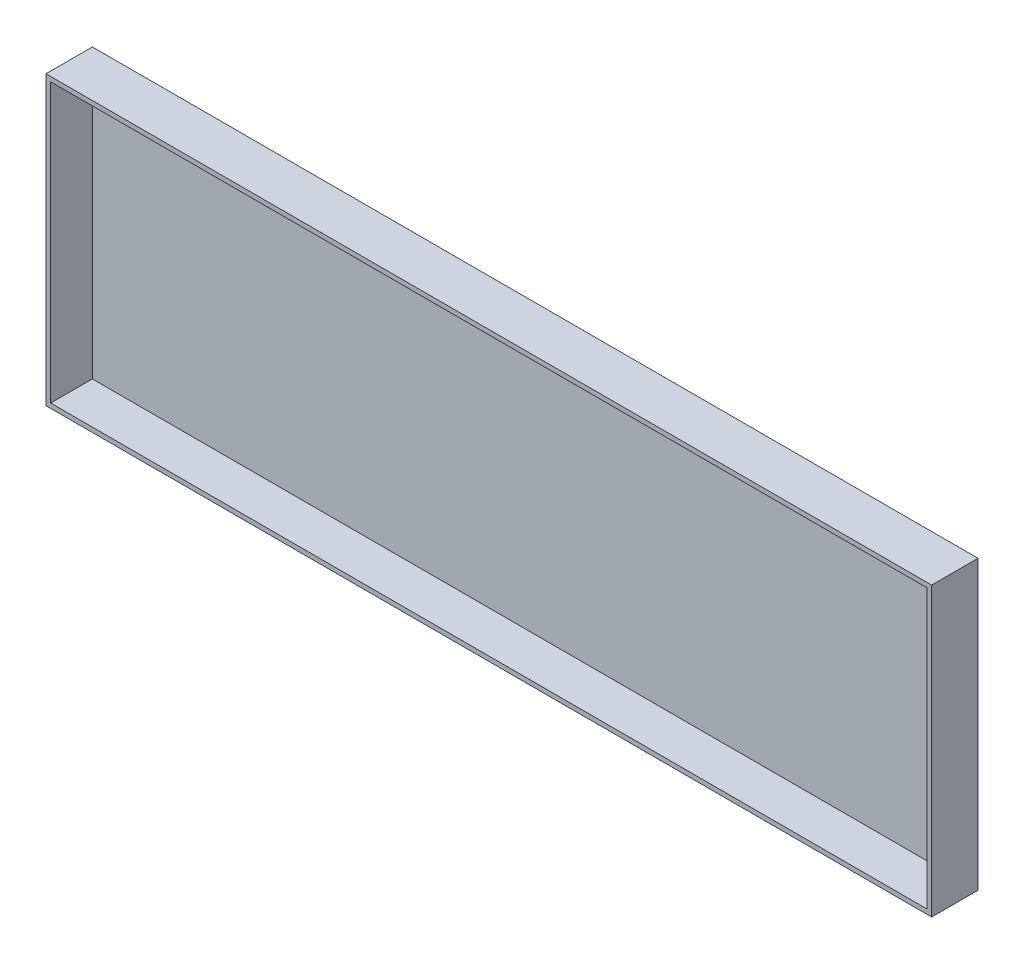
ISO-10303-21;
HEADER;
FILE_DESCRIPTION(('STEP AP214'),'2;1');
FILE_NAME('part.step','',(''),(''),'','','');
FILE_SCHEMA(('AUTOMOTIVE_DESIGN { 1 0 10303 214 1 1 1 1 }'));
ENDSEC;
DATA;
#1=APPLICATION_CONTEXT('core data for automotive mechanical design processes');
#2=APPLICATION_PROTOCOL_DEFINITION('international standard','automotive_design',2000,#1);
#3=PRODUCT_CONTEXT('',#1,'mechanical');
#4=PRODUCT('Part','Part','',(#3));
#5=PRODUCT_RELATED_PRODUCT_CATEGORY('part','',(#4));
#6=PRODUCT_DEFINITION_FORMATION('','',#4);
#7=PRODUCT_DEFINITION_CONTEXT('part definition',#1,'design');
#8=PRODUCT_DEFINITION('design','',#6,#7);
#9=PRODUCT_DEFINITION_SHAPE('','',#8);
#10=(LENGTH_UNIT() NAMED_UNIT(*) SI_UNIT(.MILLI.,.METRE.));
#11=(NAMED_UNIT(*) PLANE_ANGLE_UNIT() SI_UNIT($,.RADIAN.));
#12=(NAMED_UNIT(*) SI_UNIT($,.STERADIAN.) SOLID_ANGLE_UNIT());
#13=UNCERTAINTY_MEASURE_WITH_UNIT(LENGTH_MEASURE(1.E-05),#10,'distance_accuracy_value','');
#14=(GEOMETRIC_REPRESENTATION_CONTEXT(3) GLOBAL_UNCERTAINTY_ASSIGNED_CONTEXT((#13)) GLOBAL_UNIT_ASSIGNED_CONTEXT((#10,
#11,#12)) REPRESENTATION_CONTEXT('',''));
#15=CARTESIAN_POINT('',(0.,0.,0.));
#16=DIRECTION('',(0.,0.,1.));
#17=DIRECTION('',(1.,0.,0.));
#18=AXIS2_PLACEMENT_3D('',#15,#16,#17);
#19=CARTESIAN_POINT('',(477.5,-155.,5.));
#20=DIRECTION('',(-1.,0.,0.));
#21=DIRECTION('',(0.,0.,1.));
#22=AXIS2_PLACEMENT_3D('',#19,#20,#21);
#23=PLANE('',#22);
#24=DIRECTION('',(0.,1.,0.));
#25=VECTOR('',#24,1.);
#26=CARTESIAN_POINT('',(477.5,-155.,0.));
#27=LINE('',#26,#25);
#28=CARTESIAN_POINT('',(477.5,-155.,0.));
#29=VERTEX_POINT('',#28);
#30=CARTESIAN_POINT('',(477.5,155.,0.));
#31=VERTEX_POINT('',#30);
#32=EDGE_CURVE('E149',#29,#31,#27,.T.);
#33=ORIENTED_EDGE('',*,*,#32,.T.);
#34=DIRECTION('',(0.,0.,-1.));
#35=VECTOR('',#34,1.);
#36=CARTESIAN_POINT('',(477.5,155.,5.));
#37=LINE('',#36,#35);
#38=CARTESIAN_POINT('',(477.5,155.,50.));
#39=VERTEX_POINT('',#38);
#40=EDGE_CURVE('E11',#39,#31,#37,.T.);
#41=ORIENTED_EDGE('',*,*,#40,.F.);
#42=DIRECTION('',(0.,1.,0.));
#43=VECTOR('',#42,1.);
#44=CARTESIAN_POINT('',(477.5,0.,50.));
#45=LINE('',#44,#43);
#46=CARTESIAN_POINT('',(477.5,-155.,50.));
#47=VERTEX_POINT('',#46);
#48=EDGE_CURVE('E146',#47,#39,#45,.T.);
#49=ORIENTED_EDGE('',*,*,#48,.F.);
#50=DIRECTION('',(0.,0.,-1.));
#51=VECTOR('',#50,1.);
#52=CARTESIAN_POINT('',(477.5,-155.,5.));
#53=LINE('',#52,#51);
#54=EDGE_CURVE('E157',#47,#29,#53,.T.);
#55=ORIENTED_EDGE('',*,*,#54,.T.);
#56=EDGE_LOOP('',(#33,#41,#49,#55));
#57=FACE_BOUND('',#56,.T.);
#58=ADVANCED_FACE('F32',(#57),#23,.F.);
#59=CARTESIAN_POINT('',(-477.5,155.,5.));
#60=DIRECTION('',(0.,-1.,0.));
#61=DIRECTION('',(0.,0.,-1.));
#62=AXIS2_PLACEMENT_3D('',#59,#60,#61);
#63=PLANE('',#62);
#64=DIRECTION('',(-1.,0.,0.));
#65=VECTOR('',#64,1.);
#66=CARTESIAN_POINT('',(-477.5,155.,0.));
#67=LINE('',#66,#65);
#68=CARTESIAN_POINT('',(-477.5,155.,0.));
#69=VERTEX_POINT('',#68);
#70=EDGE_CURVE('E152',#31,#69,#67,.T.);
#71=ORIENTED_EDGE('',*,*,#70,.T.);
#72=DIRECTION('',(0.,0.,-1.));
#73=VECTOR('',#72,1.);
#74=CARTESIAN_POINT('',(-477.5,155.,5.));
#75=LINE('',#74,#73);
#76=CARTESIAN_POINT('',(-477.5,155.,50.));
#77=VERTEX_POINT('',#76);
#78=EDGE_CURVE('E39',#77,#69,#75,.T.);
#79=ORIENTED_EDGE('',*,*,#78,.F.);
#80=DIRECTION('',(-1.,0.,0.));
#81=VECTOR('',#80,1.);
#82=CARTESIAN_POINT('',(0.,155.,50.));
#83=LINE('',#82,#81);
#84=EDGE_CURVE('E114',#39,#77,#83,.T.);
#85=ORIENTED_EDGE('',*,*,#84,.F.);
#86=ORIENTED_EDGE('',*,*,#40,.T.);
#87=EDGE_LOOP('',(#71,#79,#85,#86));
#88=FACE_BOUND('',#87,.T.);
#89=ADVANCED_FACE('F175',(#88),#63,.F.);
#90=CARTESIAN_POINT('',(-477.5,-155.,5.));
#91=DIRECTION('',(1.,0.,0.));
#92=DIRECTION('',(0.,0.,-1.));
#93=AXIS2_PLACEMENT_3D('',#90,#91,#92);
#94=PLANE('',#93);
#95=DIRECTION('',(0.,-1.,0.));
#96=VECTOR('',#95,1.);
#97=CARTESIAN_POINT('',(-477.5,-155.,0.));
#98=LINE('',#97,#96);
#99=CARTESIAN_POINT('',(-477.5,-155.,0.));
#100=VERTEX_POINT('',#99);
#101=EDGE_CURVE('E154',#69,#100,#98,.T.);
#102=ORIENTED_EDGE('',*,*,#101,.T.);
#103=DIRECTION('',(0.,0.,-1.));
#104=VECTOR('',#103,1.);
#105=CARTESIAN_POINT('',(-477.5,-155.,5.));
#106=LINE('',#105,#104);
#107=CARTESIAN_POINT('',(-477.5,-155.,50.));
#108=VERTEX_POINT('',#107);
#109=EDGE_CURVE('E159',#108,#100,#106,.T.);
#110=ORIENTED_EDGE('',*,*,#109,.F.);
#111=DIRECTION('',(0.,-1.,0.));
#112=VECTOR('',#111,1.);
#113=CARTESIAN_POINT('',(-477.5,0.,50.));
#114=LINE('',#113,#112);
#115=EDGE_CURVE('E140',#77,#108,#114,.T.);
#116=ORIENTED_EDGE('',*,*,#115,.F.);
#117=ORIENTED_EDGE('',*,*,#78,.T.);
#118=EDGE_LOOP('',(#102,#110,#116,#117));
#119=FACE_BOUND('',#118,.T.);
#120=ADVANCED_FACE('F164',(#119),#94,.F.);
#121=CARTESIAN_POINT('',(-477.5,-155.,5.));
#122=DIRECTION('',(0.,1.,0.));
#123=DIRECTION('',(0.,0.,1.));
#124=AXIS2_PLACEMENT_3D('',#121,#122,#123);
#125=PLANE('',#124);
#126=DIRECTION('',(1.,0.,0.));
#127=VECTOR('',#126,1.);
#128=CARTESIAN_POINT('',(-477.5,-155.,0.));
#129=LINE('',#128,#127);
#130=EDGE_CURVE('E54',#100,#29,#129,.T.);
#131=ORIENTED_EDGE('',*,*,#130,.T.);
#132=ORIENTED_EDGE('',*,*,#54,.F.);
#133=DIRECTION('',(1.,0.,0.));
#134=VECTOR('',#133,1.);
#135=CARTESIAN_POINT('',(0.,-155.,50.));
#136=LINE('',#135,#134);
#137=EDGE_CURVE('E143',#108,#47,#136,.T.);
#138=ORIENTED_EDGE('',*,*,#137,.F.);
#139=ORIENTED_EDGE('',*,*,#109,.T.);
#140=EDGE_LOOP('',(#131,#132,#138,#139));
#141=FACE_BOUND('',#140,.T.);
#142=ADVANCED_FACE('F173',(#141),#125,.F.);
#143=CARTESIAN_POINT('',(0.,0.,0.));
#144=DIRECTION('',(0.,0.,-1.));
#145=DIRECTION('',(-1.,0.,0.));
#146=AXIS2_PLACEMENT_3D('',#143,#144,#145);
#147=PLANE('',#146);
#148=ORIENTED_EDGE('',*,*,#32,.F.);
#149=ORIENTED_EDGE('',*,*,#130,.F.);
#150=ORIENTED_EDGE('',*,*,#101,.F.);
#151=ORIENTED_EDGE('',*,*,#70,.F.);
#152=EDGE_LOOP('',(#148,#149,#150,#151));
#153=FACE_BOUND('',#152,.T.);
#154=ADVANCED_FACE('F169',(#153),#147,.T.);
#155=CARTESIAN_POINT('',(0.,0.,50.));
#156=DIRECTION('',(0.,0.,1.));
#157=DIRECTION('',(1.,0.,0.));
#158=AXIS2_PLACEMENT_3D('',#155,#156,#157);
#159=PLANE('',#158);
#160=ORIENTED_EDGE('',*,*,#84,.T.);
#161=ORIENTED_EDGE('',*,*,#115,.T.);
#162=ORIENTED_EDGE('',*,*,#137,.T.);
#163=ORIENTED_EDGE('',*,*,#48,.T.);
#164=EDGE_LOOP('',(#160,#161,#162,#163));
#165=FACE_BOUND('',#164,.T.);
#166=DIRECTION('',(0.,-1.,0.));
#167=VECTOR('',#166,1.);
#168=CARTESIAN_POINT('',(-472.5,1.74860126378462E-13,50.));
#169=LINE('',#168,#167);
#170=CARTESIAN_POINT('',(-472.5,150.,50.));
#171=VERTEX_POINT('',#170);
#172=CARTESIAN_POINT('',(-472.5,-150.,50.));
#173=VERTEX_POINT('',#172);
#174=EDGE_CURVE('E106',#171,#173,#169,.T.);
#175=ORIENTED_EDGE('',*,*,#174,.F.);
#176=DIRECTION('',(-1.,0.,0.));
#177=VECTOR('',#176,1.);
#178=CARTESIAN_POINT('',(0.,150.,50.));
#179=LINE('',#178,#177);
#180=CARTESIAN_POINT('',(472.5,150.,50.));
#181=VERTEX_POINT('',#180);
#182=EDGE_CURVE('E98',#181,#171,#179,.T.);
#183=ORIENTED_EDGE('',*,*,#182,.F.);
#184=DIRECTION('',(0.,1.,0.));
#185=VECTOR('',#184,1.);
#186=CARTESIAN_POINT('',(472.5,0.,50.));
#187=LINE('',#186,#185);
#188=CARTESIAN_POINT('',(472.5,-150.,50.));
#189=VERTEX_POINT('',#188);
#190=EDGE_CURVE('E122',#189,#181,#187,.T.);
#191=ORIENTED_EDGE('',*,*,#190,.F.);
#192=DIRECTION('',(1.,0.,0.));
#193=VECTOR('',#192,1.);
#194=CARTESIAN_POINT('',(0.,-150.,50.));
#195=LINE('',#194,#193);
#196=EDGE_CURVE('E120',#173,#189,#195,.T.);
#197=ORIENTED_EDGE('',*,*,#196,.F.);
#198=EDGE_LOOP('',(#175,#183,#191,#197));
#199=FACE_BOUND('',#198,.T.);
#200=ADVANCED_FACE('F118',(#165,#199),#159,.T.);
#201=CARTESIAN_POINT('',(0.,150.,50.));
#202=DIRECTION('',(0.,-1.,0.));
#203=DIRECTION('',(1.,0.,0.));
#204=AXIS2_PLACEMENT_3D('',#201,#202,#203);
#205=PLANE('',#204);
#206=DIRECTION('',(-1.,0.,0.));
#207=VECTOR('',#206,1.);
#208=CARTESIAN_POINT('',(0.,150.,5.));
#209=LINE('',#208,#207);
#210=CARTESIAN_POINT('',(472.5,150.,5.));
#211=VERTEX_POINT('',#210);
#212=CARTESIAN_POINT('',(-472.5,150.,5.));
#213=VERTEX_POINT('',#212);
#214=EDGE_CURVE('E126',#211,#213,#209,.T.);
#215=ORIENTED_EDGE('',*,*,#214,.F.);
#216=DIRECTION('',(0.,0.,-1.));
#217=VECTOR('',#216,1.);
#218=CARTESIAN_POINT('',(472.5,150.,50.));
#219=LINE('',#218,#217);
#220=EDGE_CURVE('E46',#181,#211,#219,.T.);
#221=ORIENTED_EDGE('',*,*,#220,.F.);
#222=ORIENTED_EDGE('',*,*,#182,.T.);
#223=DIRECTION('',(0.,0.,-1.));
#224=VECTOR('',#223,1.);
#225=CARTESIAN_POINT('',(-472.5,150.,50.));
#226=LINE('',#225,#224);
#227=EDGE_CURVE('E101',#171,#213,#226,.T.);
#228=ORIENTED_EDGE('',*,*,#227,.T.);
#229=EDGE_LOOP('',(#215,#221,#222,#228));
#230=FACE_BOUND('',#229,.T.);
#231=ADVANCED_FACE('F100',(#230),#205,.T.);
#232=CARTESIAN_POINT('',(-472.5,1.74860126378462E-13,50.));
#233=DIRECTION('',(1.,0.,0.));
#234=DIRECTION('',(0.,1.,0.));
#235=AXIS2_PLACEMENT_3D('',#232,#233,#234);
#236=PLANE('',#235);
#237=DIRECTION('',(0.,-1.,0.));
#238=VECTOR('',#237,1.);
#239=CARTESIAN_POINT('',(-472.5,1.74860126378462E-13,5.));
#240=LINE('',#239,#238);
#241=CARTESIAN_POINT('',(-472.5,-150.,5.));
#242=VERTEX_POINT('',#241);
#243=EDGE_CURVE('E113',#213,#242,#240,.T.);
#244=ORIENTED_EDGE('',*,*,#243,.F.);
#245=ORIENTED_EDGE('',*,*,#227,.F.);
#246=ORIENTED_EDGE('',*,*,#174,.T.);
#247=DIRECTION('',(0.,0.,-1.));
#248=VECTOR('',#247,1.);
#249=CARTESIAN_POINT('',(-472.5,-150.,50.));
#250=LINE('',#249,#248);
#251=EDGE_CURVE('E115',#173,#242,#250,.T.);
#252=ORIENTED_EDGE('',*,*,#251,.T.);
#253=EDGE_LOOP('',(#244,#245,#246,#252));
#254=FACE_BOUND('',#253,.T.);
#255=ADVANCED_FACE('F110',(#254),#236,.T.);
#256=CARTESIAN_POINT('',(0.,-150.,50.));
#257=DIRECTION('',(0.,1.,0.));
#258=DIRECTION('',(-1.,0.,0.));
#259=AXIS2_PLACEMENT_3D('',#256,#257,#258);
#260=PLANE('',#259);
#261=DIRECTION('',(1.,0.,0.));
#262=VECTOR('',#261,1.);
#263=CARTESIAN_POINT('',(0.,-150.,5.));
#264=LINE('',#263,#262);
#265=CARTESIAN_POINT('',(472.5,-150.,5.));
#266=VERTEX_POINT('',#265);
#267=EDGE_CURVE('E129',#242,#266,#264,.T.);
#268=ORIENTED_EDGE('',*,*,#267,.F.);
#269=ORIENTED_EDGE('',*,*,#251,.F.);
#270=ORIENTED_EDGE('',*,*,#196,.T.);
#271=DIRECTION('',(0.,0.,-1.));
#272=VECTOR('',#271,1.);
#273=CARTESIAN_POINT('',(472.5,-150.,50.));
#274=LINE('',#273,#272);
#275=EDGE_CURVE('E135',#189,#266,#274,.T.);
#276=ORIENTED_EDGE('',*,*,#275,.T.);
#277=EDGE_LOOP('',(#268,#269,#270,#276));
#278=FACE_BOUND('',#277,.T.);
#279=ADVANCED_FACE('F198',(#278),#260,.T.);
#280=CARTESIAN_POINT('',(472.5,0.,50.));
#281=DIRECTION('',(-1.,0.,0.));
#282=DIRECTION('',(0.,0.,1.));
#283=AXIS2_PLACEMENT_3D('',#280,#281,#282);
#284=PLANE('',#283);
#285=DIRECTION('',(0.,1.,0.));
#286=VECTOR('',#285,1.);
#287=CARTESIAN_POINT('',(472.5,0.,5.));
#288=LINE('',#287,#286);
#289=EDGE_CURVE('E107',#266,#211,#288,.T.);
#290=ORIENTED_EDGE('',*,*,#289,.F.);
#291=ORIENTED_EDGE('',*,*,#275,.F.);
#292=ORIENTED_EDGE('',*,*,#190,.T.);
#293=ORIENTED_EDGE('',*,*,#220,.T.);
#294=EDGE_LOOP('',(#290,#291,#292,#293));
#295=FACE_BOUND('',#294,.T.);
#296=ADVANCED_FACE('F190',(#295),#284,.T.);
#297=CARTESIAN_POINT('',(0.,0.,5.));
#298=DIRECTION('',(0.,0.,-1.));
#299=DIRECTION('',(-1.,0.,0.));
#300=AXIS2_PLACEMENT_3D('',#297,#298,#299);
#301=PLANE('',#300);
#302=ORIENTED_EDGE('',*,*,#289,.T.);
#303=ORIENTED_EDGE('',*,*,#214,.T.);
#304=ORIENTED_EDGE('',*,*,#243,.T.);
#305=ORIENTED_EDGE('',*,*,#267,.T.);
#306=EDGE_LOOP('',(#302,#303,#304,#305));
#307=FACE_BOUND('',#306,.T.);
#308=ADVANCED_FACE('F187',(#307),#301,.F.);
#309=CLOSED_SHELL('',(#58,#89,#120,#142,#154,#200,#231,#255,#279,#296,#308));
#310=MANIFOLD_SOLID_BREP('B2',#309);
#311=ADVANCED_BREP_SHAPE_REPRESENTATION('',(#18,#310),#14);
#312=SHAPE_DEFINITION_REPRESENTATION(#9,#311);
ENDSEC;
END-ISO-10303-21;
